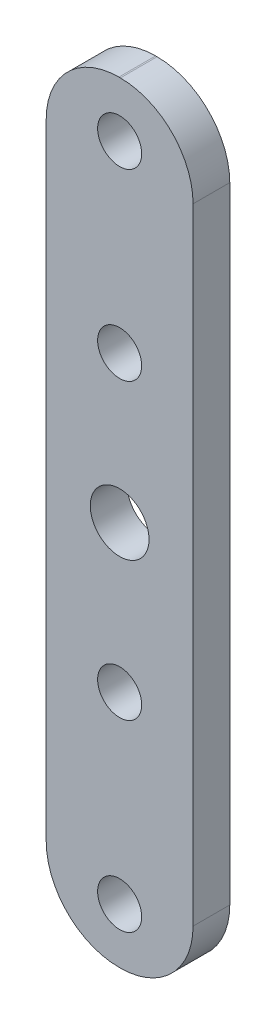
ISO-10303-21;
HEADER;
FILE_DESCRIPTION(('STEP AP214'),'2;1');
FILE_NAME('part.step','',(''),(''),'','','');
FILE_SCHEMA(('AUTOMOTIVE_DESIGN { 1 0 10303 214 1 1 1 1 }'));
ENDSEC;
DATA;
#1=APPLICATION_CONTEXT('core data for automotive mechanical design processes');
#2=APPLICATION_PROTOCOL_DEFINITION('international standard','automotive_design',2000,#1);
#3=PRODUCT_CONTEXT('',#1,'mechanical');
#4=PRODUCT('Part','Part','',(#3));
#5=PRODUCT_RELATED_PRODUCT_CATEGORY('part','',(#4));
#6=PRODUCT_DEFINITION_FORMATION('','',#4);
#7=PRODUCT_DEFINITION_CONTEXT('part definition',#1,'design');
#8=PRODUCT_DEFINITION('design','',#6,#7);
#9=PRODUCT_DEFINITION_SHAPE('','',#8);
#10=(LENGTH_UNIT() NAMED_UNIT(*) SI_UNIT(.MILLI.,.METRE.));
#11=(NAMED_UNIT(*) PLANE_ANGLE_UNIT() SI_UNIT($,.RADIAN.));
#12=(NAMED_UNIT(*) SI_UNIT($,.STERADIAN.) SOLID_ANGLE_UNIT());
#13=UNCERTAINTY_MEASURE_WITH_UNIT(LENGTH_MEASURE(1.E-05),#10,'distance_accuracy_value','');
#14=(GEOMETRIC_REPRESENTATION_CONTEXT(3) GLOBAL_UNCERTAINTY_ASSIGNED_CONTEXT((#13)) GLOBAL_UNIT_ASSIGNED_CONTEXT((#10,
#11,#12)) REPRESENTATION_CONTEXT('',''));
#15=CARTESIAN_POINT('',(0.,0.,0.));
#16=DIRECTION('',(0.,0.,1.));
#17=DIRECTION('',(1.,0.,0.));
#18=AXIS2_PLACEMENT_3D('',#15,#16,#17);
#19=CARTESIAN_POINT('',(10.1,95.1,5.));
#20=DIRECTION('',(0.,0.,-1.));
#21=DIRECTION('',(-1.,0.,0.));
#22=AXIS2_PLACEMENT_3D('',#19,#20,#21);
#23=PLANE('',#22);
#24=CARTESIAN_POINT('',(10.,32.5,5.));
#25=DIRECTION('',(0.,0.,1.));
#26=DIRECTION('',(1.,0.,0.));
#27=AXIS2_PLACEMENT_3D('',#24,#25,#26);
#28=CIRCLE('',#27,3.);
#29=CARTESIAN_POINT('',(13.,32.5,5.));
#30=VERTEX_POINT('',#29);
#31=EDGE_CURVE('E192',#30,#30,#28,.T.);
#32=ORIENTED_EDGE('',*,*,#31,.F.);
#33=EDGE_LOOP('',(#32));
#34=FACE_BOUND('',#33,.T.);
#35=CARTESIAN_POINT('',(10.,97.5,5.));
#36=DIRECTION('',(0.,0.,1.));
#37=DIRECTION('',(1.,0.,0.));
#38=AXIS2_PLACEMENT_3D('',#35,#36,#37);
#39=CIRCLE('',#38,3.);
#40=CARTESIAN_POINT('',(13.,97.5,5.));
#41=VERTEX_POINT('',#40);
#42=EDGE_CURVE('E180',#41,#41,#39,.T.);
#43=ORIENTED_EDGE('',*,*,#42,.F.);
#44=EDGE_LOOP('',(#43));
#45=FACE_BOUND('',#44,.T.);
#46=CARTESIAN_POINT('',(10.1,95.1,5.));
#47=DIRECTION('',(0.,0.,1.));
#48=DIRECTION('',(-1.,0.,0.));
#49=AXIS2_PLACEMENT_3D('',#46,#47,#48);
#50=CIRCLE('',#49,9.9);
#51=CARTESIAN_POINT('',(20.,95.0999999999999,5.));
#52=VERTEX_POINT('',#51);
#53=CARTESIAN_POINT('',(10.0999999999999,105.,5.));
#54=VERTEX_POINT('',#53);
#55=EDGE_CURVE('E143',#52,#54,#50,.T.);
#56=ORIENTED_EDGE('',*,*,#55,.T.);
#57=DIRECTION('',(-1.,0.,0.));
#58=VECTOR('',#57,1.);
#59=CARTESIAN_POINT('',(9.90000000000005,105.,5.));
#60=LINE('',#59,#58);
#61=CARTESIAN_POINT('',(9.90000000000005,105.,5.));
#62=VERTEX_POINT('',#61);
#63=EDGE_CURVE('E91',#54,#62,#60,.T.);
#64=ORIENTED_EDGE('',*,*,#63,.T.);
#65=CARTESIAN_POINT('',(9.89999999999998,95.1,5.));
#66=DIRECTION('',(0.,0.,1.));
#67=DIRECTION('',(-1.,0.,0.));
#68=AXIS2_PLACEMENT_3D('',#65,#66,#67);
#69=CIRCLE('',#68,9.9);
#70=CARTESIAN_POINT('',(0.,95.0999999999999,5.));
#71=VERTEX_POINT('',#70);
#72=EDGE_CURVE('E158',#62,#71,#69,.T.);
#73=ORIENTED_EDGE('',*,*,#72,.T.);
#74=DIRECTION('',(0.,-1.,0.));
#75=VECTOR('',#74,1.);
#76=CARTESIAN_POINT('',(0.,9.90000000000007,5.));
#77=LINE('',#76,#75);
#78=CARTESIAN_POINT('',(0.,9.90000000000007,5.));
#79=VERTEX_POINT('',#78);
#80=EDGE_CURVE('E171',#71,#79,#77,.T.);
#81=ORIENTED_EDGE('',*,*,#80,.T.);
#82=CARTESIAN_POINT('',(9.9,9.9,5.));
#83=DIRECTION('',(0.,0.,1.));
#84=DIRECTION('',(-1.,0.,0.));
#85=AXIS2_PLACEMENT_3D('',#82,#83,#84);
#86=CIRCLE('',#85,9.9);
#87=CARTESIAN_POINT('',(9.90000000000007,0.,5.));
#88=VERTEX_POINT('',#87);
#89=EDGE_CURVE('E110',#79,#88,#86,.T.);
#90=ORIENTED_EDGE('',*,*,#89,.T.);
#91=DIRECTION('',(1.,0.,0.));
#92=VECTOR('',#91,1.);
#93=CARTESIAN_POINT('',(9.90000000000007,0.,5.));
#94=LINE('',#93,#92);
#95=CARTESIAN_POINT('',(10.0999999999999,0.,5.));
#96=VERTEX_POINT('',#95);
#97=EDGE_CURVE('E104',#88,#96,#94,.T.);
#98=ORIENTED_EDGE('',*,*,#97,.T.);
#99=CARTESIAN_POINT('',(10.1,9.9,5.));
#100=DIRECTION('',(0.,0.,1.));
#101=DIRECTION('',(1.,0.,0.));
#102=AXIS2_PLACEMENT_3D('',#99,#100,#101);
#103=CIRCLE('',#102,9.9);
#104=CARTESIAN_POINT('',(20.,9.90000000000007,5.));
#105=VERTEX_POINT('',#104);
#106=EDGE_CURVE('E108',#96,#105,#103,.T.);
#107=ORIENTED_EDGE('',*,*,#106,.T.);
#108=DIRECTION('',(0.,1.,0.));
#109=VECTOR('',#108,1.);
#110=CARTESIAN_POINT('',(20.,9.90000000000007,5.));
#111=LINE('',#110,#109);
#112=EDGE_CURVE('E48',#105,#52,#111,.T.);
#113=ORIENTED_EDGE('',*,*,#112,.T.);
#114=EDGE_LOOP('',(#56,#64,#73,#81,#90,#98,#107,#113));
#115=FACE_BOUND('',#114,.T.);
#116=CARTESIAN_POINT('',(10.,52.5,5.));
#117=DIRECTION('',(0.,0.,1.));
#118=DIRECTION('',(1.,0.,0.));
#119=AXIS2_PLACEMENT_3D('',#116,#117,#118);
#120=CIRCLE('',#119,4.);
#121=CARTESIAN_POINT('',(14.,52.5,5.));
#122=VERTEX_POINT('',#121);
#123=EDGE_CURVE('E132',#122,#122,#120,.T.);
#124=ORIENTED_EDGE('',*,*,#123,.F.);
#125=EDGE_LOOP('',(#124));
#126=FACE_BOUND('',#125,.T.);
#127=CARTESIAN_POINT('',(10.,7.5,5.));
#128=DIRECTION('',(0.,0.,1.));
#129=DIRECTION('',(1.,0.,0.));
#130=AXIS2_PLACEMENT_3D('',#127,#128,#129);
#131=CIRCLE('',#130,3.);
#132=CARTESIAN_POINT('',(13.,7.5,5.));
#133=VERTEX_POINT('',#132);
#134=EDGE_CURVE('E186',#133,#133,#131,.T.);
#135=ORIENTED_EDGE('',*,*,#134,.F.);
#136=EDGE_LOOP('',(#135));
#137=FACE_BOUND('',#136,.T.);
#138=CARTESIAN_POINT('',(10.,72.5,5.));
#139=DIRECTION('',(0.,0.,1.));
#140=DIRECTION('',(1.,0.,0.));
#141=AXIS2_PLACEMENT_3D('',#138,#139,#140);
#142=CIRCLE('',#141,3.);
#143=CARTESIAN_POINT('',(13.,72.5,5.));
#144=VERTEX_POINT('',#143);
#145=EDGE_CURVE('E198',#144,#144,#142,.T.);
#146=ORIENTED_EDGE('',*,*,#145,.F.);
#147=EDGE_LOOP('',(#146));
#148=FACE_BOUND('',#147,.T.);
#149=ADVANCED_FACE('F31',(#34,#45,#115,#126,#137,#148),#23,.F.);
#150=CARTESIAN_POINT('',(10.1,95.1,0.));
#151=DIRECTION('',(0.,0.,-1.));
#152=DIRECTION('',(-1.,0.,0.));
#153=AXIS2_PLACEMENT_3D('',#150,#151,#152);
#154=PLANE('',#153);
#155=CARTESIAN_POINT('',(10.,32.5,0.));
#156=DIRECTION('',(0.,0.,1.));
#157=DIRECTION('',(1.,0.,0.));
#158=AXIS2_PLACEMENT_3D('',#155,#156,#157);
#159=CIRCLE('',#158,3.);
#160=CARTESIAN_POINT('',(13.,32.5,0.));
#161=VERTEX_POINT('',#160);
#162=EDGE_CURVE('E195',#161,#161,#159,.T.);
#163=ORIENTED_EDGE('',*,*,#162,.T.);
#164=EDGE_LOOP('',(#163));
#165=FACE_BOUND('',#164,.T.);
#166=CARTESIAN_POINT('',(10.,97.5,0.));
#167=DIRECTION('',(0.,0.,1.));
#168=DIRECTION('',(1.,0.,0.));
#169=AXIS2_PLACEMENT_3D('',#166,#167,#168);
#170=CIRCLE('',#169,3.);
#171=CARTESIAN_POINT('',(13.,97.5,0.));
#172=VERTEX_POINT('',#171);
#173=EDGE_CURVE('E183',#172,#172,#170,.T.);
#174=ORIENTED_EDGE('',*,*,#173,.T.);
#175=EDGE_LOOP('',(#174));
#176=FACE_BOUND('',#175,.T.);
#177=CARTESIAN_POINT('',(10.1,95.1,0.));
#178=DIRECTION('',(0.,0.,1.));
#179=DIRECTION('',(-1.,0.,0.));
#180=AXIS2_PLACEMENT_3D('',#177,#178,#179);
#181=CIRCLE('',#180,9.9);
#182=CARTESIAN_POINT('',(20.,95.0999999999999,0.));
#183=VERTEX_POINT('',#182);
#184=CARTESIAN_POINT('',(10.0999999999999,105.,0.));
#185=VERTEX_POINT('',#184);
#186=EDGE_CURVE('E128',#183,#185,#181,.T.);
#187=ORIENTED_EDGE('',*,*,#186,.F.);
#188=DIRECTION('',(0.,1.,0.));
#189=VECTOR('',#188,1.);
#190=CARTESIAN_POINT('',(20.,9.90000000000007,0.));
#191=LINE('',#190,#189);
#192=CARTESIAN_POINT('',(20.,9.90000000000007,0.));
#193=VERTEX_POINT('',#192);
#194=EDGE_CURVE('E83',#193,#183,#191,.T.);
#195=ORIENTED_EDGE('',*,*,#194,.F.);
#196=CARTESIAN_POINT('',(10.1,9.9,0.));
#197=DIRECTION('',(0.,0.,1.));
#198=DIRECTION('',(1.,0.,0.));
#199=AXIS2_PLACEMENT_3D('',#196,#197,#198);
#200=CIRCLE('',#199,9.9);
#201=CARTESIAN_POINT('',(10.0999999999999,0.,0.));
#202=VERTEX_POINT('',#201);
#203=EDGE_CURVE('E77',#202,#193,#200,.T.);
#204=ORIENTED_EDGE('',*,*,#203,.F.);
#205=DIRECTION('',(1.,0.,0.));
#206=VECTOR('',#205,1.);
#207=CARTESIAN_POINT('',(9.90000000000007,0.,0.));
#208=LINE('',#207,#206);
#209=CARTESIAN_POINT('',(9.90000000000007,0.,0.));
#210=VERTEX_POINT('',#209);
#211=EDGE_CURVE('E118',#210,#202,#208,.T.);
#212=ORIENTED_EDGE('',*,*,#211,.F.);
#213=CARTESIAN_POINT('',(9.9,9.9,0.));
#214=DIRECTION('',(0.,0.,1.));
#215=DIRECTION('',(-1.,0.,0.));
#216=AXIS2_PLACEMENT_3D('',#213,#214,#215);
#217=CIRCLE('',#216,9.9);
#218=CARTESIAN_POINT('',(0.,9.90000000000007,0.));
#219=VERTEX_POINT('',#218);
#220=EDGE_CURVE('E138',#219,#210,#217,.T.);
#221=ORIENTED_EDGE('',*,*,#220,.F.);
#222=DIRECTION('',(0.,-1.,0.));
#223=VECTOR('',#222,1.);
#224=CARTESIAN_POINT('',(0.,9.90000000000007,0.));
#225=LINE('',#224,#223);
#226=CARTESIAN_POINT('',(0.,95.0999999999999,0.));
#227=VERTEX_POINT('',#226);
#228=EDGE_CURVE('E136',#227,#219,#225,.T.);
#229=ORIENTED_EDGE('',*,*,#228,.F.);
#230=CARTESIAN_POINT('',(9.89999999999998,95.1,0.));
#231=DIRECTION('',(0.,0.,1.));
#232=DIRECTION('',(-1.,0.,0.));
#233=AXIS2_PLACEMENT_3D('',#230,#231,#232);
#234=CIRCLE('',#233,9.9);
#235=CARTESIAN_POINT('',(9.90000000000005,105.,0.));
#236=VERTEX_POINT('',#235);
#237=EDGE_CURVE('E134',#236,#227,#234,.T.);
#238=ORIENTED_EDGE('',*,*,#237,.F.);
#239=DIRECTION('',(-1.,0.,0.));
#240=VECTOR('',#239,1.);
#241=CARTESIAN_POINT('',(9.90000000000005,105.,0.));
#242=LINE('',#241,#240);
#243=EDGE_CURVE('E131',#185,#236,#242,.T.);
#244=ORIENTED_EDGE('',*,*,#243,.F.);
#245=EDGE_LOOP('',(#187,#195,#204,#212,#221,#229,#238,#244));
#246=FACE_BOUND('',#245,.T.);
#247=CARTESIAN_POINT('',(10.,52.5,0.));
#248=DIRECTION('',(0.,0.,1.));
#249=DIRECTION('',(1.,0.,0.));
#250=AXIS2_PLACEMENT_3D('',#247,#248,#249);
#251=CIRCLE('',#250,4.);
#252=CARTESIAN_POINT('',(14.,52.5,0.));
#253=VERTEX_POINT('',#252);
#254=EDGE_CURVE('E177',#253,#253,#251,.T.);
#255=ORIENTED_EDGE('',*,*,#254,.T.);
#256=EDGE_LOOP('',(#255));
#257=FACE_BOUND('',#256,.T.);
#258=CARTESIAN_POINT('',(10.,7.5,0.));
#259=DIRECTION('',(0.,0.,1.));
#260=DIRECTION('',(1.,0.,0.));
#261=AXIS2_PLACEMENT_3D('',#258,#259,#260);
#262=CIRCLE('',#261,3.);
#263=CARTESIAN_POINT('',(13.,7.5,0.));
#264=VERTEX_POINT('',#263);
#265=EDGE_CURVE('E189',#264,#264,#262,.T.);
#266=ORIENTED_EDGE('',*,*,#265,.T.);
#267=EDGE_LOOP('',(#266));
#268=FACE_BOUND('',#267,.T.);
#269=CARTESIAN_POINT('',(10.,72.5,0.));
#270=DIRECTION('',(0.,0.,1.));
#271=DIRECTION('',(1.,0.,0.));
#272=AXIS2_PLACEMENT_3D('',#269,#270,#271);
#273=CIRCLE('',#272,3.);
#274=CARTESIAN_POINT('',(13.,72.5,0.));
#275=VERTEX_POINT('',#274);
#276=EDGE_CURVE('E201',#275,#275,#273,.T.);
#277=ORIENTED_EDGE('',*,*,#276,.T.);
#278=EDGE_LOOP('',(#277));
#279=FACE_BOUND('',#278,.T.);
#280=ADVANCED_FACE('F162',(#165,#176,#246,#257,#268,#279),#154,.T.);
#281=CARTESIAN_POINT('',(10.1,95.1,5.));
#282=DIRECTION('',(0.,0.,-1.));
#283=DIRECTION('',(-1.,0.,0.));
#284=AXIS2_PLACEMENT_3D('',#281,#282,#283);
#285=CYLINDRICAL_SURFACE('',#284,9.9);
#286=ORIENTED_EDGE('',*,*,#186,.T.);
#287=DIRECTION('',(0.,0.,-1.));
#288=VECTOR('',#287,1.);
#289=CARTESIAN_POINT('',(10.0999999999999,105.,5.));
#290=LINE('',#289,#288);
#291=EDGE_CURVE('E11',#54,#185,#290,.T.);
#292=ORIENTED_EDGE('',*,*,#291,.F.);
#293=ORIENTED_EDGE('',*,*,#55,.F.);
#294=DIRECTION('',(0.,0.,-1.));
#295=VECTOR('',#294,1.);
#296=CARTESIAN_POINT('',(20.,95.0999999999999,5.));
#297=LINE('',#296,#295);
#298=EDGE_CURVE('E124',#52,#183,#297,.T.);
#299=ORIENTED_EDGE('',*,*,#298,.T.);
#300=EDGE_LOOP('',(#286,#292,#293,#299));
#301=FACE_BOUND('',#300,.T.);
#302=ADVANCED_FACE('F33',(#301),#285,.T.);
#303=CARTESIAN_POINT('',(9.90000000000005,105.,5.));
#304=DIRECTION('',(0.,-1.,0.));
#305=DIRECTION('',(0.,0.,-1.));
#306=AXIS2_PLACEMENT_3D('',#303,#304,#305);
#307=PLANE('',#306);
#308=ORIENTED_EDGE('',*,*,#243,.T.);
#309=DIRECTION('',(0.,0.,-1.));
#310=VECTOR('',#309,1.);
#311=CARTESIAN_POINT('',(9.90000000000005,105.,5.));
#312=LINE('',#311,#310);
#313=EDGE_CURVE('E40',#62,#236,#312,.T.);
#314=ORIENTED_EDGE('',*,*,#313,.F.);
#315=ORIENTED_EDGE('',*,*,#63,.F.);
#316=ORIENTED_EDGE('',*,*,#291,.T.);
#317=EDGE_LOOP('',(#308,#314,#315,#316));
#318=FACE_BOUND('',#317,.T.);
#319=ADVANCED_FACE('F236',(#318),#307,.F.);
#320=CARTESIAN_POINT('',(9.89999999999998,95.1,5.));
#321=DIRECTION('',(0.,0.,-1.));
#322=DIRECTION('',(-1.,0.,0.));
#323=AXIS2_PLACEMENT_3D('',#320,#321,#322);
#324=CYLINDRICAL_SURFACE('',#323,9.9);
#325=ORIENTED_EDGE('',*,*,#237,.T.);
#326=DIRECTION('',(0.,0.,-1.));
#327=VECTOR('',#326,1.);
#328=CARTESIAN_POINT('',(0.,95.0999999999999,5.));
#329=LINE('',#328,#327);
#330=EDGE_CURVE('E150',#71,#227,#329,.T.);
#331=ORIENTED_EDGE('',*,*,#330,.F.);
#332=ORIENTED_EDGE('',*,*,#72,.F.);
#333=ORIENTED_EDGE('',*,*,#313,.T.);
#334=EDGE_LOOP('',(#325,#331,#332,#333));
#335=FACE_BOUND('',#334,.T.);
#336=ADVANCED_FACE('F156',(#335),#324,.T.);
#337=CARTESIAN_POINT('',(0.,9.90000000000007,5.));
#338=DIRECTION('',(1.,0.,0.));
#339=DIRECTION('',(0.,1.,0.));
#340=AXIS2_PLACEMENT_3D('',#337,#338,#339);
#341=PLANE('',#340);
#342=ORIENTED_EDGE('',*,*,#228,.T.);
#343=DIRECTION('',(0.,0.,-1.));
#344=VECTOR('',#343,1.);
#345=CARTESIAN_POINT('',(0.,9.90000000000007,5.));
#346=LINE('',#345,#344);
#347=EDGE_CURVE('E147',#79,#219,#346,.T.);
#348=ORIENTED_EDGE('',*,*,#347,.F.);
#349=ORIENTED_EDGE('',*,*,#80,.F.);
#350=ORIENTED_EDGE('',*,*,#330,.T.);
#351=EDGE_LOOP('',(#342,#348,#349,#350));
#352=FACE_BOUND('',#351,.T.);
#353=ADVANCED_FACE('F167',(#352),#341,.F.);
#354=CARTESIAN_POINT('',(9.9,9.9,5.));
#355=DIRECTION('',(0.,0.,-1.));
#356=DIRECTION('',(-1.,0.,0.));
#357=AXIS2_PLACEMENT_3D('',#354,#355,#356);
#358=CYLINDRICAL_SURFACE('',#357,9.9);
#359=ORIENTED_EDGE('',*,*,#220,.T.);
#360=DIRECTION('',(0.,0.,-1.));
#361=VECTOR('',#360,1.);
#362=CARTESIAN_POINT('',(9.90000000000007,0.,5.));
#363=LINE('',#362,#361);
#364=EDGE_CURVE('E119',#88,#210,#363,.T.);
#365=ORIENTED_EDGE('',*,*,#364,.F.);
#366=ORIENTED_EDGE('',*,*,#89,.F.);
#367=ORIENTED_EDGE('',*,*,#347,.T.);
#368=EDGE_LOOP('',(#359,#365,#366,#367));
#369=FACE_BOUND('',#368,.T.);
#370=ADVANCED_FACE('F170',(#369),#358,.T.);
#371=CARTESIAN_POINT('',(9.90000000000007,0.,5.));
#372=DIRECTION('',(0.,1.,0.));
#373=DIRECTION('',(0.,0.,1.));
#374=AXIS2_PLACEMENT_3D('',#371,#372,#373);
#375=PLANE('',#374);
#376=ORIENTED_EDGE('',*,*,#211,.T.);
#377=DIRECTION('',(0.,0.,-1.));
#378=VECTOR('',#377,1.);
#379=CARTESIAN_POINT('',(10.0999999999999,0.,5.));
#380=LINE('',#379,#378);
#381=EDGE_CURVE('E115',#96,#202,#380,.T.);
#382=ORIENTED_EDGE('',*,*,#381,.F.);
#383=ORIENTED_EDGE('',*,*,#97,.F.);
#384=ORIENTED_EDGE('',*,*,#364,.T.);
#385=EDGE_LOOP('',(#376,#382,#383,#384));
#386=FACE_BOUND('',#385,.T.);
#387=ADVANCED_FACE('F116',(#386),#375,.F.);
#388=CARTESIAN_POINT('',(10.1,9.9,5.));
#389=DIRECTION('',(0.,0.,-1.));
#390=DIRECTION('',(-1.,0.,0.));
#391=AXIS2_PLACEMENT_3D('',#388,#389,#390);
#392=CYLINDRICAL_SURFACE('',#391,9.9);
#393=ORIENTED_EDGE('',*,*,#203,.T.);
#394=DIRECTION('',(0.,0.,-1.));
#395=VECTOR('',#394,1.);
#396=CARTESIAN_POINT('',(20.,9.90000000000007,5.));
#397=LINE('',#396,#395);
#398=EDGE_CURVE('E120',#105,#193,#397,.T.);
#399=ORIENTED_EDGE('',*,*,#398,.F.);
#400=ORIENTED_EDGE('',*,*,#106,.F.);
#401=ORIENTED_EDGE('',*,*,#381,.T.);
#402=EDGE_LOOP('',(#393,#399,#400,#401));
#403=FACE_BOUND('',#402,.T.);
#404=ADVANCED_FACE('F122',(#403),#392,.T.);
#405=CARTESIAN_POINT('',(20.,9.90000000000007,5.));
#406=DIRECTION('',(-1.,0.,0.));
#407=DIRECTION('',(0.,-1.,0.));
#408=AXIS2_PLACEMENT_3D('',#405,#406,#407);
#409=PLANE('',#408);
#410=ORIENTED_EDGE('',*,*,#194,.T.);
#411=ORIENTED_EDGE('',*,*,#298,.F.);
#412=ORIENTED_EDGE('',*,*,#112,.F.);
#413=ORIENTED_EDGE('',*,*,#398,.T.);
#414=EDGE_LOOP('',(#410,#411,#412,#413));
#415=FACE_BOUND('',#414,.T.);
#416=ADVANCED_FACE('F224',(#415),#409,.F.);
#417=CARTESIAN_POINT('',(10.,52.5,5.));
#418=DIRECTION('',(0.,0.,-1.));
#419=DIRECTION('',(-1.,0.,0.));
#420=AXIS2_PLACEMENT_3D('',#417,#418,#419);
#421=CYLINDRICAL_SURFACE('',#420,4.);
#422=ORIENTED_EDGE('',*,*,#123,.T.);
#423=EDGE_LOOP('',(#422));
#424=FACE_BOUND('',#423,.T.);
#425=ORIENTED_EDGE('',*,*,#254,.F.);
#426=EDGE_LOOP('',(#425));
#427=FACE_BOUND('',#426,.T.);
#428=ADVANCED_FACE('F221',(#424,#427),#421,.F.);
#429=CARTESIAN_POINT('',(10.,97.5,5.));
#430=DIRECTION('',(0.,0.,-1.));
#431=DIRECTION('',(-1.,0.,0.));
#432=AXIS2_PLACEMENT_3D('',#429,#430,#431);
#433=CYLINDRICAL_SURFACE('',#432,3.);
#434=ORIENTED_EDGE('',*,*,#42,.T.);
#435=EDGE_LOOP('',(#434));
#436=FACE_BOUND('',#435,.T.);
#437=ORIENTED_EDGE('',*,*,#173,.F.);
#438=EDGE_LOOP('',(#437));
#439=FACE_BOUND('',#438,.T.);
#440=ADVANCED_FACE('F300',(#436,#439),#433,.F.);
#441=CARTESIAN_POINT('',(10.,7.5,5.));
#442=DIRECTION('',(0.,0.,-1.));
#443=DIRECTION('',(-1.,0.,0.));
#444=AXIS2_PLACEMENT_3D('',#441,#442,#443);
#445=CYLINDRICAL_SURFACE('',#444,3.);
#446=ORIENTED_EDGE('',*,*,#134,.T.);
#447=EDGE_LOOP('',(#446));
#448=FACE_BOUND('',#447,.T.);
#449=ORIENTED_EDGE('',*,*,#265,.F.);
#450=EDGE_LOOP('',(#449));
#451=FACE_BOUND('',#450,.T.);
#452=ADVANCED_FACE('F308',(#448,#451),#445,.F.);
#453=CARTESIAN_POINT('',(10.,32.5,5.));
#454=DIRECTION('',(0.,0.,-1.));
#455=DIRECTION('',(-1.,0.,0.));
#456=AXIS2_PLACEMENT_3D('',#453,#454,#455);
#457=CYLINDRICAL_SURFACE('',#456,3.);
#458=ORIENTED_EDGE('',*,*,#31,.T.);
#459=EDGE_LOOP('',(#458));
#460=FACE_BOUND('',#459,.T.);
#461=ORIENTED_EDGE('',*,*,#162,.F.);
#462=EDGE_LOOP('',(#461));
#463=FACE_BOUND('',#462,.T.);
#464=ADVANCED_FACE('F316',(#460,#463),#457,.F.);
#465=CARTESIAN_POINT('',(10.,72.5,5.));
#466=DIRECTION('',(0.,0.,-1.));
#467=DIRECTION('',(-1.,0.,0.));
#468=AXIS2_PLACEMENT_3D('',#465,#466,#467);
#469=CYLINDRICAL_SURFACE('',#468,3.);
#470=ORIENTED_EDGE('',*,*,#145,.T.);
#471=EDGE_LOOP('',(#470));
#472=FACE_BOUND('',#471,.T.);
#473=ORIENTED_EDGE('',*,*,#276,.F.);
#474=EDGE_LOOP('',(#473));
#475=FACE_BOUND('',#474,.T.);
#476=ADVANCED_FACE('F207',(#472,#475),#469,.F.);
#477=CLOSED_SHELL('',(#149,#280,#302,#319,#336,#353,#370,#387,#404,#416,#428,#440,#452,#464,#476));
#478=MANIFOLD_SOLID_BREP('B2',#477);
#479=ADVANCED_BREP_SHAPE_REPRESENTATION('',(#18,#478),#14);
#480=SHAPE_DEFINITION_REPRESENTATION(#9,#479);
ENDSEC;
END-ISO-10303-21;
